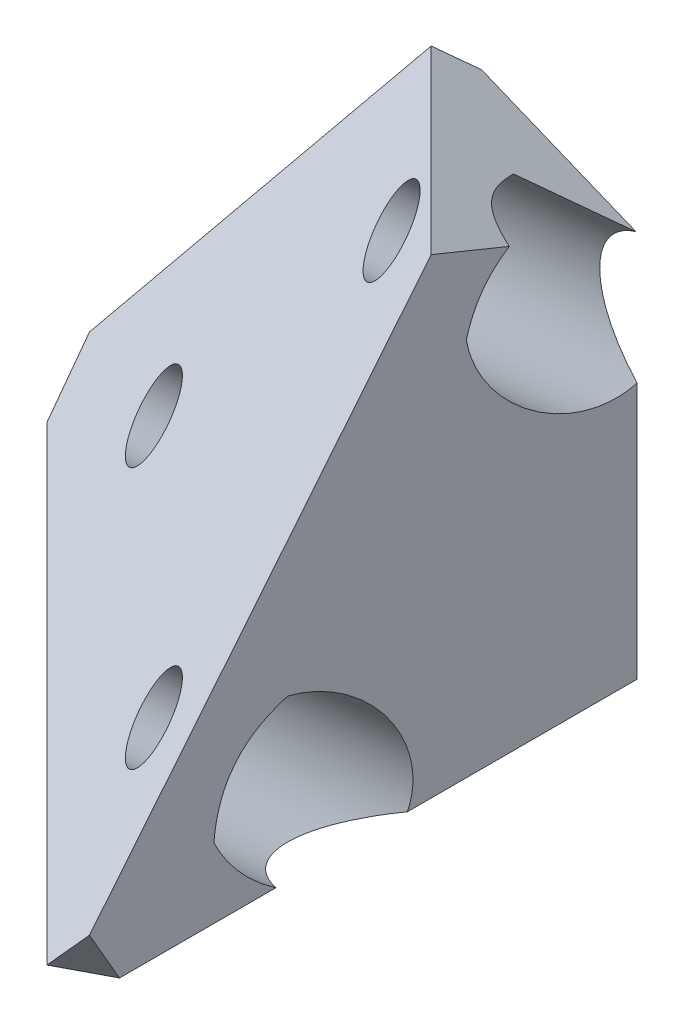
ISO-10303-21;
HEADER;
FILE_DESCRIPTION(('STEP AP214'),'2;1');
FILE_NAME('part.step','',(''),(''),'','','');
FILE_SCHEMA(('AUTOMOTIVE_DESIGN { 1 0 10303 214 1 1 1 1 }'));
ENDSEC;
DATA;
#1=APPLICATION_CONTEXT('core data for automotive mechanical design processes');
#2=APPLICATION_PROTOCOL_DEFINITION('international standard','automotive_design',2000,#1);
#3=PRODUCT_CONTEXT('',#1,'mechanical');
#4=PRODUCT('Part','Part','',(#3));
#5=PRODUCT_RELATED_PRODUCT_CATEGORY('part','',(#4));
#6=PRODUCT_DEFINITION_FORMATION('','',#4);
#7=PRODUCT_DEFINITION_CONTEXT('part definition',#1,'design');
#8=PRODUCT_DEFINITION('design','',#6,#7);
#9=PRODUCT_DEFINITION_SHAPE('','',#8);
#10=(LENGTH_UNIT() NAMED_UNIT(*) SI_UNIT(.MILLI.,.METRE.));
#11=(NAMED_UNIT(*) PLANE_ANGLE_UNIT() SI_UNIT($,.RADIAN.));
#12=(NAMED_UNIT(*) SI_UNIT($,.STERADIAN.) SOLID_ANGLE_UNIT());
#13=UNCERTAINTY_MEASURE_WITH_UNIT(LENGTH_MEASURE(1.E-05),#10,'distance_accuracy_value','');
#14=(GEOMETRIC_REPRESENTATION_CONTEXT(3) GLOBAL_UNCERTAINTY_ASSIGNED_CONTEXT((#13)) GLOBAL_UNIT_ASSIGNED_CONTEXT((#10,
#11,#12)) REPRESENTATION_CONTEXT('',''));
#15=CARTESIAN_POINT('',(0.,0.,0.));
#16=DIRECTION('',(0.,0.,1.));
#17=DIRECTION('',(1.,0.,0.));
#18=AXIS2_PLACEMENT_3D('',#15,#16,#17);
#19=CARTESIAN_POINT('',(7.77817459305202,0.,7.77817459305202));
#20=DIRECTION('',(0.612372435695797,-0.499999999999995,-0.612372435695797));
#21=DIRECTION('',(-0.707106781186548,0.,-0.707106781186548));
#22=AXIS2_PLACEMENT_3D('',#19,#20,#21);
#23=PLANE('',#22);
#24=CARTESIAN_POINT('',(5.48007755419573,3.89711431702999,2.2980970388563));
#25=DIRECTION('',(0.612372435695797,-0.499999999999995,-0.612372435695797));
#26=DIRECTION('',(-0.707106781186548,0.,-0.707106781186548));
#27=AXIS2_PLACEMENT_3D('',#24,#25,#26);
#28=CIRCLE('',#27,1.2);
#29=CARTESIAN_POINT('',(4.63154941677188,3.89711431702999,1.44956890143245));
#30=VERTEX_POINT('',#29);
#31=EDGE_CURVE('E205',#30,#30,#28,.T.);
#32=ORIENTED_EDGE('',*,*,#31,.T.);
#33=EDGE_LOOP('',(#32));
#34=FACE_BOUND('',#33,.T.);
#35=CARTESIAN_POINT('',(5.12652416360242,12.5573683548744,-5.12652416360242));
#36=DIRECTION('',(0.612372435695797,-0.499999999999995,-0.612372435695797));
#37=DIRECTION('',(-0.707106781186548,0.,-0.707106781186548));
#38=AXIS2_PLACEMENT_3D('',#35,#36,#37);
#39=CIRCLE('',#38,1.2);
#40=CARTESIAN_POINT('',(4.27799602617856,12.5573683548744,-5.97505230102627));
#41=VERTEX_POINT('',#40);
#42=EDGE_CURVE('E274',#41,#41,#39,.T.);
#43=ORIENTED_EDGE('',*,*,#42,.T.);
#44=EDGE_LOOP('',(#43));
#45=FACE_BOUND('',#44,.T.);
#46=CARTESIAN_POINT('',(-2.29809703885629,3.89711431702998,-5.48007755419572));
#47=DIRECTION('',(0.612372435695797,-0.499999999999995,-0.612372435695797));
#48=DIRECTION('',(-0.707106781186548,0.,-0.707106781186548));
#49=AXIS2_PLACEMENT_3D('',#46,#47,#48);
#50=CIRCLE('',#49,1.2);
#51=CARTESIAN_POINT('',(-3.14662517628014,3.89711431702998,-6.32860569161957));
#52=VERTEX_POINT('',#51);
#53=EDGE_CURVE('E172',#52,#52,#50,.T.);
#54=ORIENTED_EDGE('',*,*,#53,.T.);
#55=EDGE_LOOP('',(#54));
#56=FACE_BOUND('',#55,.T.);
#57=DIRECTION('',(-0.707106781186548,0.,-0.707106781186548));
#58=VECTOR('',#57,1.);
#59=CARTESIAN_POINT('',(13.493650659546,14.,2.06269852655802));
#60=LINE('',#59,#58);
#61=CARTESIAN_POINT('',(7.77817459305201,14.,-3.652777539936));
#62=VERTEX_POINT('',#61);
#63=CARTESIAN_POINT('',(2.40277753993601,14.,-9.02817459305201));
#64=VERTEX_POINT('',#63);
#65=EDGE_CURVE('E151',#62,#64,#60,.T.);
#66=ORIENTED_EDGE('',*,*,#65,.T.);
#67=DIRECTION('',(-0.632455532033671,-0.774596669241488,0.));
#68=VECTOR('',#67,1.);
#69=CARTESIAN_POINT('',(2.902777539936,14.6123724356958,-9.02817459305201));
#70=LINE('',#69,#68);
#71=CARTESIAN_POINT('',(-7.76326352898467,1.54919333848297,-9.02817459305202));
#72=VERTEX_POINT('',#71);
#73=EDGE_CURVE('E145',#64,#72,#70,.T.);
#74=ORIENTED_EDGE('',*,*,#73,.T.);
#75=DIRECTION('',(-0.070997556956417,0.736685209782636,-0.672498511963955));
#76=VECTOR('',#75,1.);
#77=CARTESIAN_POINT('',(-6.80146553352508,-8.43061988929634,0.0821067811865705));
#78=LINE('',#77,#76);
#79=CARTESIAN_POINT('',(-7.61396103067891,0.,-7.61396103067891));
#80=VERTEX_POINT('',#79);
#81=EDGE_CURVE('E341',#80,#72,#78,.T.);
#82=ORIENTED_EDGE('',*,*,#81,.F.);
#83=DIRECTION('',(0.707106781186548,0.,0.707106781186548));
#84=VECTOR('',#83,1.);
#85=CARTESIAN_POINT('',(-7.77817459305204,0.,-7.77817459305201));
#86=LINE('',#85,#84);
#87=CARTESIAN_POINT('',(6.36396103067893,0.,6.36396103067893));
#88=VERTEX_POINT('',#87);
#89=EDGE_CURVE('E163',#80,#88,#86,.T.);
#90=ORIENTED_EDGE('',*,*,#89,.T.);
#91=DIRECTION('',(0.672498511963954,0.736685209782637,0.070997556956415));
#92=VECTOR('',#91,1.);
#93=CARTESIAN_POINT('',(7.07106781186547,0.774596669241485,6.4386122798318));
#94=LINE('',#93,#92);
#95=CARTESIAN_POINT('',(7.77817459305201,1.54919333848299,6.5132635289847));
#96=VERTEX_POINT('',#95);
#97=EDGE_CURVE('E138',#88,#96,#94,.T.);
#98=ORIENTED_EDGE('',*,*,#97,.T.);
#99=DIRECTION('',(0.,-0.774596669241488,0.632455532033671));
#100=VECTOR('',#99,1.);
#101=CARTESIAN_POINT('',(7.77817459305201,16.0210235533031,-5.30293636118238));
#102=LINE('',#101,#100);
#103=EDGE_CURVE('E154',#62,#96,#102,.T.);
#104=ORIENTED_EDGE('',*,*,#103,.F.);
#105=EDGE_LOOP('',(#66,#74,#82,#90,#98,#104));
#106=FACE_BOUND('',#105,.T.);
#107=ADVANCED_FACE('F36',(#34,#45,#56,#106),#23,.F.);
#108=CARTESIAN_POINT('',(0.,0.,-9.77817459305201));
#109=DIRECTION('',(0.,0.,-1.));
#110=DIRECTION('',(-1.,0.,0.));
#111=AXIS2_PLACEMENT_3D('',#108,#109,#110);
#112=PLANE('',#111);
#113=CARTESIAN_POINT('',(2.77817459305201,9.5,-9.77817459305201));
#114=DIRECTION('',(0.,0.,-1.));
#115=DIRECTION('',(-1.,0.,0.));
#116=AXIS2_PLACEMENT_3D('',#113,#114,#115);
#117=CIRCLE('',#116,1.025);
#118=CARTESIAN_POINT('',(1.75317459305201,9.5,-9.77817459305201));
#119=VERTEX_POINT('',#118);
#120=EDGE_CURVE('E337',#119,#119,#117,.T.);
#121=ORIENTED_EDGE('',*,*,#120,.F.);
#122=EDGE_LOOP('',(#121));
#123=FACE_BOUND('',#122,.T.);
#124=CARTESIAN_POINT('',(5.77817459305201,1.5,-9.77817459305201));
#125=DIRECTION('',(0.,0.,-1.));
#126=DIRECTION('',(-1.,0.,0.));
#127=AXIS2_PLACEMENT_3D('',#124,#125,#126);
#128=CIRCLE('',#127,1.025);
#129=CARTESIAN_POINT('',(4.75317459305201,1.5,-9.77817459305201));
#130=VERTEX_POINT('',#129);
#131=EDGE_CURVE('E328',#130,#130,#128,.T.);
#132=ORIENTED_EDGE('',*,*,#131,.F.);
#133=EDGE_LOOP('',(#132));
#134=FACE_BOUND('',#133,.T.);
#135=CARTESIAN_POINT('',(-3.72182540694799,1.5,-9.77817459305201));
#136=DIRECTION('',(0.,0.,-1.));
#137=DIRECTION('',(-1.,0.,0.));
#138=AXIS2_PLACEMENT_3D('',#135,#136,#137);
#139=CIRCLE('',#138,1.025);
#140=CARTESIAN_POINT('',(-4.74682540694799,1.5,-9.77817459305201));
#141=VERTEX_POINT('',#140);
#142=EDGE_CURVE('E319',#141,#141,#139,.T.);
#143=ORIENTED_EDGE('',*,*,#142,.F.);
#144=EDGE_LOOP('',(#143));
#145=FACE_BOUND('',#144,.T.);
#146=DIRECTION('',(0.632455532033672,0.774596669241487,0.));
#147=VECTOR('',#146,1.);
#148=CARTESIAN_POINT('',(-7.77817459305204,0.,-9.77817459305201));
#149=LINE('',#148,#147);
#150=CARTESIAN_POINT('',(-7.01326352898467,0.936820902787187,-9.778174593052));
#151=VERTEX_POINT('',#150);
#152=CARTESIAN_POINT('',(3.15277753993601,13.3876275643042,-9.77817459305201));
#153=VERTEX_POINT('',#152);
#154=EDGE_CURVE('E144',#151,#153,#149,.T.);
#155=ORIENTED_EDGE('',*,*,#154,.T.);
#156=DIRECTION('',(0.925820099772553,-0.377964473009223,0.));
#157=VECTOR('',#156,1.);
#158=CARTESIAN_POINT('',(5.13509056270002,12.5783516615966,-9.77817459305201));
#159=LINE('',#158,#157);
#160=CARTESIAN_POINT('',(7.74589250207991,11.512496233105,-9.77817459305201));
#161=VERTEX_POINT('',#160);
#162=EDGE_CURVE('E127',#153,#161,#159,.T.);
#163=ORIENTED_EDGE('',*,*,#162,.T.);
#164=CARTESIAN_POINT('',(9.77817459305201,8.75931168355787,-9.77817459305201));
#165=DIRECTION('',(0.,0.,-1.));
#166=DIRECTION('',(0.774596669241488,-0.632455532033671,0.));
#167=AXIS2_PLACEMENT_3D('',#164,#165,#166);
#168=ELLIPSE('',#167,3.59258495608198,2.2);
#169=CARTESIAN_POINT('',(7.77817459305201,7.62987232857541,-9.77817459305201));
#170=VERTEX_POINT('',#169);
#171=EDGE_CURVE('E273',#170,#161,#168,.T.);
#172=ORIENTED_EDGE('',*,*,#171,.F.);
#173=DIRECTION('',(0.,-1.,0.));
#174=VECTOR('',#173,1.);
#175=CARTESIAN_POINT('',(7.77817459305201,14.,-9.77817459305201));
#176=LINE('',#175,#174);
#177=CARTESIAN_POINT('',(7.77817459305201,0.,-9.77817459305201));
#178=VERTEX_POINT('',#177);
#179=EDGE_CURVE('E175',#170,#178,#176,.T.);
#180=ORIENTED_EDGE('',*,*,#179,.T.);
#181=DIRECTION('',(-1.,0.,0.));
#182=VECTOR('',#181,1.);
#183=CARTESIAN_POINT('',(7.77817459305201,0.,-9.77817459305201));
#184=LINE('',#183,#182);
#185=CARTESIAN_POINT('',(4.94670061761697,0.,-9.77817459305201));
#186=VERTEX_POINT('',#185);
#187=EDGE_CURVE('E152',#178,#186,#184,.T.);
#188=ORIENTED_EDGE('',*,*,#187,.T.);
#189=CARTESIAN_POINT('',(2.,0.387732780308283,-9.77817459305201));
#190=DIRECTION('',(0.,0.,-1.));
#191=DIRECTION('',(0.774596669241488,-0.632455532033671,0.));
#192=AXIS2_PLACEMENT_3D('',#189,#190,#191);
#193=ELLIPSE('',#192,3.59258495608198,2.2);
#194=CARTESIAN_POINT('',(-0.566801630294588,0.,-9.77817459305201));
#195=VERTEX_POINT('',#194);
#196=EDGE_CURVE('E169',#195,#186,#193,.T.);
#197=ORIENTED_EDGE('',*,*,#196,.F.);
#198=CARTESIAN_POINT('',(-6.47155050539988,0.,-9.77817459305201));
#199=VERTEX_POINT('',#198);
#200=EDGE_CURVE('E157',#195,#199,#184,.T.);
#201=ORIENTED_EDGE('',*,*,#200,.T.);
#202=DIRECTION('',(-0.500581513841691,0.865689406195987,0.));
#203=VECTOR('',#202,1.);
#204=CARTESIAN_POINT('',(-4.84989739444499,-2.80443420274282,-9.77817459305201));
#205=LINE('',#204,#203);
#206=EDGE_CURVE('E150',#199,#151,#205,.T.);
#207=ORIENTED_EDGE('',*,*,#206,.T.);
#208=EDGE_LOOP('',(#155,#163,#172,#180,#188,#197,#201,#207));
#209=FACE_BOUND('',#208,.T.);
#210=ADVANCED_FACE('F148',(#123,#134,#145,#209),#112,.T.);
#211=CARTESIAN_POINT('',(16.4987931404748,3.511272183616,-22.6241901935908));
#212=DIRECTION('',(-0.47434164902526,0.38729833462074,-0.790569415042093));
#213=DIRECTION('',(-0.857492925712542,0.,0.51449575542753));
#214=AXIS2_PLACEMENT_3D('',#211,#212,#213);
#215=PLANE('',#214);
#216=ORIENTED_EDGE('',*,*,#73,.F.);
#217=DIRECTION('',(-0.612372435695797,0.499999999999995,0.612372435695796));
#218=VECTOR('',#217,1.);
#219=CARTESIAN_POINT('',(8.98640848472507,8.62448784348983,-15.6118055378411));
#220=LINE('',#219,#218);
#221=EDGE_CURVE('E130',#153,#64,#220,.T.);
#222=ORIENTED_EDGE('',*,*,#221,.F.);
#223=ORIENTED_EDGE('',*,*,#154,.F.);
#224=DIRECTION('',(-0.612372435695797,0.499999999999995,0.612372435695796));
#225=VECTOR('',#224,1.);
#226=CARTESIAN_POINT('',(-1.1796325841956,-3.8263188180272,-15.6118055378411));
#227=LINE('',#226,#225);
#228=EDGE_CURVE('E348',#151,#72,#227,.T.);
#229=ORIENTED_EDGE('',*,*,#228,.T.);
#230=EDGE_LOOP('',(#216,#222,#223,#229));
#231=FACE_BOUND('',#230,.T.);
#232=ADVANCED_FACE('F142',(#231),#215,.T.);
#233=CARTESIAN_POINT('',(7.77817459305201,14.,-7.77817459305201));
#234=DIRECTION('',(-1.,0.,0.));
#235=DIRECTION('',(0.,0.,1.));
#236=AXIS2_PLACEMENT_3D('',#233,#234,#235);
#237=PLANE('',#236);
#238=DIRECTION('',(0.,-0.377964473009223,-0.925820099772553));
#239=VECTOR('',#238,1.);
#240=CARTESIAN_POINT('',(7.77817459305201,12.5564117476406,-7.18883215689259));
#241=LINE('',#240,#239);
#242=CARTESIAN_POINT('',(7.77817459305201,13.0514055848529,-5.97634982990018));
#243=VERTEX_POINT('',#242);
#244=EDGE_CURVE('E59',#62,#243,#241,.T.);
#245=ORIENTED_EDGE('',*,*,#244,.F.);
#246=ORIENTED_EDGE('',*,*,#103,.T.);
#247=DIRECTION('',(0.,-0.865689406195988,-0.500581513841689));
#248=VECTOR('',#247,1.);
#249=CARTESIAN_POINT('',(7.77817459305201,4.68688605890053,8.32762207457266));
#250=LINE('',#249,#248);
#251=CARTESIAN_POINT('',(7.77817459305201,0.,5.61744853915022));
#252=VERTEX_POINT('',#251);
#253=EDGE_CURVE('E11',#96,#252,#250,.T.);
#254=ORIENTED_EDGE('',*,*,#253,.T.);
#255=DIRECTION('',(0.,0.,-1.));
#256=VECTOR('',#255,1.);
#257=CARTESIAN_POINT('',(7.77817459305201,0.,-7.77817459305201));
#258=LINE('',#257,#256);
#259=CARTESIAN_POINT('',(7.77817459305201,0.,0.965555556191639));
#260=VERTEX_POINT('',#259);
#261=EDGE_CURVE('E167',#252,#260,#258,.T.);
#262=ORIENTED_EDGE('',*,*,#261,.T.);
#263=CARTESIAN_POINT('',(7.77817459305201,2.02072594216373,0.));
#264=DIRECTION('',(-1.,0.,0.));
#265=DIRECTION('',(0.,-0.632455532033671,-0.774596669241488));
#266=AXIS2_PLACEMENT_3D('',#263,#264,#265);
#267=ELLIPSE('',#266,3.59258495608198,2.2);
#268=CARTESIAN_POINT('',(7.77817459305201,2.08205267061465,2.81219938247284));
#269=VERTEX_POINT('',#268);
#270=EDGE_CURVE('E272',#260,#269,#267,.T.);
#271=ORIENTED_EDGE('',*,*,#270,.T.);
#272=CARTESIAN_POINT('',(7.77817459305201,-1.46523937085973,2.40216880114115));
#273=CARTESIAN_POINT('',(7.77817459305201,-1.34837869357034,2.43021220506226));
#274=CARTESIAN_POINT('',(7.77817459305201,-1.23131853807404,2.45744341729871));
#275=CARTESIAN_POINT('',(7.77817459305201,-0.996758198230225,2.51002099243453));
#276=CARTESIAN_POINT('',(7.77817459305201,-0.87925795123037,2.53536707534943));
#277=CARTESIAN_POINT('',(7.77817459305201,-0.643341097655707,2.58400232488337));
#278=CARTESIAN_POINT('',(7.77817459305201,-0.524922705453131,2.60728287760446));
#279=CARTESIAN_POINT('',(7.77817459305201,-0.28762276868389,2.65133264591242));
#280=CARTESIAN_POINT('',(7.77817459305201,-0.168741244465505,2.67210197057691));
#281=CARTESIAN_POINT('',(7.77817459305201,0.075079307116677,2.71162416893788));
#282=CARTESIAN_POINT('',(7.77817459305201,0.200041243821958,2.73023702466399));
#283=CARTESIAN_POINT('',(7.77817459305201,0.450469439276992,2.76367392375601));
#284=CARTESIAN_POINT('',(7.77817459305201,0.575935665668776,2.77849820639632));
#285=CARTESIAN_POINT('',(7.77817459305201,0.827142663671958,2.80360117956389));
#286=CARTESIAN_POINT('',(7.77817459305201,0.952882746567789,2.81388661771524));
#287=CARTESIAN_POINT('',(7.77817459305201,1.20467775112745,2.82900788625435));
#288=CARTESIAN_POINT('',(7.77817459305201,1.33073259721409,2.83384491839403));
#289=CARTESIAN_POINT('',(7.77817459305201,1.58107983627891,2.83686106851646));
#290=CARTESIAN_POINT('',(7.77817459305201,1.70537074218489,2.83513753266637));
#291=CARTESIAN_POINT('',(7.77817459305201,1.95367531390866,2.82380631922013));
#292=CARTESIAN_POINT('',(7.77817459305201,2.07768886205951,2.81419576594866));
#293=CARTESIAN_POINT('',(7.77817459305201,2.32340935798838,2.78545202560531));
#294=CARTESIAN_POINT('',(7.77817459305201,2.44512699019545,2.76641381110682));
#295=CARTESIAN_POINT('',(7.77817459305201,2.68619326027645,2.71684112920488));
#296=CARTESIAN_POINT('',(7.77817459305201,2.80554396207554,2.68631718714397));
#297=CARTESIAN_POINT('',(7.77817459305201,2.99252384775001,2.62682048084125));
#298=CARTESIAN_POINT('',(7.77817459305201,3.06154962734746,2.60221282772116));
#299=CARTESIAN_POINT('',(7.77817459305201,3.19752539554464,2.54783217231711));
#300=CARTESIAN_POINT('',(7.77817459305201,3.26447616075961,2.51806113073656));
#301=CARTESIAN_POINT('',(7.77817459305201,3.39565815760516,2.45311952961341));
#302=CARTESIAN_POINT('',(7.77817459305201,3.45989129772559,2.41795284231668));
#303=CARTESIAN_POINT('',(7.77817459305201,3.58504286186643,2.34213175634248));
#304=CARTESIAN_POINT('',(7.77817459305201,3.64596131254885,2.3014774018147));
#305=CARTESIAN_POINT('',(7.77817459305201,3.7641595535538,2.21462272075713));
#306=CARTESIAN_POINT('',(7.77817459305201,3.82142066089097,2.16839693769356));
#307=CARTESIAN_POINT('',(7.77817459305201,3.93149847759505,2.07093215914904));
#308=CARTESIAN_POINT('',(7.77817459305201,3.9843152499389,2.01969323472737));
#309=CARTESIAN_POINT('',(7.77817459305201,4.08522524265884,1.91273950048749));
#310=CARTESIAN_POINT('',(7.77817459305201,4.13331708310807,1.85702339168333));
#311=CARTESIAN_POINT('',(7.77817459305201,4.22468185310455,1.74177750797472));
#312=CARTESIAN_POINT('',(7.77817459305201,4.26795408130578,1.68224718000856));
#313=CARTESIAN_POINT('',(7.77817459305201,4.36314033058143,1.54008524088639));
#314=CARTESIAN_POINT('',(7.77817459305201,4.4132654241259,1.45625516289575));
#315=CARTESIAN_POINT('',(7.77817459305201,4.50583006920854,1.28446101418824));
#316=CARTESIAN_POINT('',(7.77817459305201,4.54826617069025,1.19649510990935));
#317=CARTESIAN_POINT('',(7.77817459305201,4.62664030921155,1.01674246432798));
#318=CARTESIAN_POINT('',(7.77817459305201,4.66251243988357,0.924927262726007));
#319=CARTESIAN_POINT('',(7.77817459305201,4.72813362656173,0.739192491949394));
#320=CARTESIAN_POINT('',(7.77817459305201,4.75788445306765,0.645273539993979));
#321=CARTESIAN_POINT('',(7.77817459305201,4.82202477676682,0.421369385871752));
#322=CARTESIAN_POINT('',(7.77817459305201,4.85414160860193,0.29073659104298));
#323=CARTESIAN_POINT('',(7.77817459305201,4.9104058333661,0.0277387530766699));
#324=CARTESIAN_POINT('',(7.77817459305201,4.9345488094387,-0.104627208032631));
#325=CARTESIAN_POINT('',(7.77817459305201,4.9763814934383,-0.370815912091538));
#326=CARTESIAN_POINT('',(7.77817459305201,4.99404903194207,-0.504642073668993));
#327=CARTESIAN_POINT('',(7.77817459305201,5.02397878746291,-0.772855349756281));
#328=CARTESIAN_POINT('',(7.77817459305201,5.03624208942657,-0.907242346200019));
#329=CARTESIAN_POINT('',(7.77817459305201,5.05574179538574,-1.16908172451194));
#330=CARTESIAN_POINT('',(7.77817459305201,5.06321370922737,-1.29651707701414));
#331=CARTESIAN_POINT('',(7.77817459305201,5.0747553422517,-1.55154833281685));
#332=CARTESIAN_POINT('',(7.77817459305201,5.07882477094299,-1.67914424889449));
#333=CARTESIAN_POINT('',(7.77817459305201,5.08403797506982,-1.93334232046244));
#334=CARTESIAN_POINT('',(7.77817459305201,5.08520552096815,-2.05994402454192));
#335=CARTESIAN_POINT('',(7.77817459305201,5.08506159046554,-2.31311334794636));
#336=CARTESIAN_POINT('',(7.77817459305201,5.0837507778965,-2.43968096731928));
#337=CARTESIAN_POINT('',(7.77817459305201,5.08138973635184,-2.56622130545494));
#338=B_SPLINE_CURVE_WITH_KNOTS('',3,(#272,#273,#274,#275,#276,#277,#278,#279,#280,#281,#282,
#283,#284,#285,#286,#287,#288,#289,#290,#291,#292,#293,#294,#295,#296,#297,#298,#299,#300,#301,
#302,#303,#304,#305,#306,#307,#308,#309,#310,#311,#312,#313,#314,#315,#316,#317,#318,#319,#320,
#321,#322,#323,#324,#325,#326,#327,#328,#329,#330,#331,#332,#333,#334,#335,#336,#337),
.UNSPECIFIED.,.F.,.F.,(4,2,2,2,2,2,2,2,2,2,2,2,2,2,2,2,2,2,2,2,2,2,2,2,2,2,2,2,2,2,2,2,4),(0.,
0.360538916809042,0.721131275334835,1.08316292244804,1.44517883871459,1.82415156293787,
2.20310034651284,2.58148385632234,2.95978388993559,3.33249271653441,3.70533749642828,
4.07450045770999,4.44332594440326,4.66298977265172,4.88257036943632,5.10199411252672,
5.32141609040214,5.54188161681566,5.7623440186712,5.98287061685024,6.20342926406613,
6.49597282088031,6.78864731888483,7.08411604035172,7.37949918120376,7.78273566281232,
8.18619513092748,8.59102326505938,8.99577008942413,9.37868057147329,9.76162374164488,
10.1414195800544,10.5211137040117),.UNSPECIFIED.);
#339=CARTESIAN_POINT('',(7.77817459305201,4.76384201328488,0.622527553414212));
#340=VERTEX_POINT('',#339);
#341=EDGE_CURVE('E265',#269,#340,#338,.T.);
#342=ORIENTED_EDGE('',*,*,#341,.T.);
#343=CARTESIAN_POINT('',(7.77817459305201,0.,-2.94545454351396));
#344=VERTEX_POINT('',#343);
#345=EDGE_CURVE('E204',#340,#344,#267,.T.);
#346=ORIENTED_EDGE('',*,*,#345,.T.);
#347=EDGE_CURVE('E166',#344,#178,#258,.T.);
#348=ORIENTED_EDGE('',*,*,#347,.T.);
#349=ORIENTED_EDGE('',*,*,#179,.F.);
#350=CARTESIAN_POINT('',(7.77817459305201,10.3923048454133,-7.77817459305201));
#351=DIRECTION('',(-1.,0.,0.));
#352=DIRECTION('',(0.,-0.632455532033671,-0.774596669241488));
#353=AXIS2_PLACEMENT_3D('',#350,#351,#352);
#354=ELLIPSE('',#353,3.59258495608198,2.2);
#355=CARTESIAN_POINT('',(7.77817459305201,11.2820436393967,-4.69956178810359));
#356=VERTEX_POINT('',#355);
#357=EDGE_CURVE('E184',#170,#356,#354,.T.);
#358=ORIENTED_EDGE('',*,*,#357,.T.);
#359=CARTESIAN_POINT('',(7.77817459305201,7.00249953389614,-4.88708142728171));
#360=CARTESIAN_POINT('',(7.77817459305201,7.12777052495781,-4.86010995895349));
#361=CARTESIAN_POINT('',(7.77817459305201,7.2532589601214,-4.83411975783075));
#362=CARTESIAN_POINT('',(7.77817459305201,7.50470908989263,-4.78441760731941));
#363=CARTESIAN_POINT('',(7.77817459305201,7.63067086693296,-4.76070607587488));
#364=CARTESIAN_POINT('',(7.77817459305201,7.88369905860409,-4.71577364359335));
#365=CARTESIAN_POINT('',(7.77817459305201,8.01076783719855,-4.69456595929945));
#366=CARTESIAN_POINT('',(7.77817459305201,8.26537264781197,-4.65519382271879));
#367=CARTESIAN_POINT('',(7.77817459305201,8.39290865642879,-4.63702922008641));
#368=CARTESIAN_POINT('',(7.77817459305201,8.65540398412109,-4.60334525661565));
#369=CARTESIAN_POINT('',(7.77817459305201,8.79038907104462,-4.58802400682817));
#370=CARTESIAN_POINT('',(7.77817459305201,9.06080526808491,-4.56204013315484));
#371=CARTESIAN_POINT('',(7.77817459305201,9.19623634258187,-4.55137714590211));
#372=CARTESIAN_POINT('',(7.77817459305201,9.46717694155111,-4.53562796844191));
#373=CARTESIAN_POINT('',(7.77817459305201,9.60268582535412,-4.53053119556042));
#374=CARTESIAN_POINT('',(7.77817459305201,9.8737796268596,-4.52700778879887));
#375=CARTESIAN_POINT('',(7.77817459305201,10.0093645192152,-4.52857958793403));
#376=CARTESIAN_POINT('',(7.77817459305201,10.2778968095452,-4.53970249982042));
#377=CARTESIAN_POINT('',(7.77817459305201,10.4108494260686,-4.54911576511537));
#378=CARTESIAN_POINT('',(7.77817459305201,10.6758395066159,-4.577387501796));
#379=CARTESIAN_POINT('',(7.77817459305201,10.807876648335,-4.59624914386569));
#380=CARTESIAN_POINT('',(7.77817459305201,11.0682870450279,-4.64503280395969));
#381=CARTESIAN_POINT('',(7.77817459305201,11.1966853193418,-4.67481778588721));
#382=CARTESIAN_POINT('',(7.77817459305201,11.4497188754518,-4.7474300526326));
#383=CARTESIAN_POINT('',(7.77817459305201,11.5743578676512,-4.79024398184206));
#384=CARTESIAN_POINT('',(7.77817459305201,11.7716419616484,-4.87161137962604));
#385=CARTESIAN_POINT('',(7.77817459305201,11.8461517902947,-4.90567116557925));
#386=CARTESIAN_POINT('',(7.77817459305201,11.9921370831937,-4.97970542093812));
#387=CARTESIAN_POINT('',(7.77817459305201,12.0636143836637,-5.01967624344373));
#388=CARTESIAN_POINT('',(7.77817459305201,12.2029000479998,-5.1056098744135));
#389=CARTESIAN_POINT('',(7.77817459305201,12.2707076559282,-5.1515739108505));
#390=CARTESIAN_POINT('',(7.77817459305201,12.4020054267917,-5.24931118332886));
#391=CARTESIAN_POINT('',(7.77817459305201,12.4654954912856,-5.30108455175349));
#392=CARTESIAN_POINT('',(7.77817459305201,12.5876443909077,-5.41002376119841));
#393=CARTESIAN_POINT('',(7.77817459305201,12.646304003169,-5.46718873161943));
#394=CARTESIAN_POINT('',(7.77817459305201,12.7584989786755,-5.58633187437504));
#395=CARTESIAN_POINT('',(7.77817459305201,12.8120343358337,-5.64831005242697));
#396=CARTESIAN_POINT('',(7.77817459305201,12.9139204491413,-5.77643004160631));
#397=CARTESIAN_POINT('',(7.77817459305201,12.9622684884449,-5.84257400605255));
#398=CARTESIAN_POINT('',(7.77817459305201,13.0538586322624,-5.978298514847));
#399=CARTESIAN_POINT('',(7.77817459305201,13.0971000434112,-6.04787952405354));
#400=CARTESIAN_POINT('',(7.77817459305201,13.2004806651461,-6.22765997323781));
#401=CARTESIAN_POINT('',(7.77817459305201,13.2573461680321,-6.33974663452367));
#402=CARTESIAN_POINT('',(7.77817459305201,13.3609444488657,-6.56850750007883));
#403=CARTESIAN_POINT('',(7.77817459305201,13.4076707106562,-6.68518459791407));
#404=CARTESIAN_POINT('',(7.77817459305201,13.4928003920209,-6.92280455166958));
#405=CARTESIAN_POINT('',(7.77817459305201,13.5311168327734,-7.04377820371592));
#406=CARTESIAN_POINT('',(7.77817459305201,13.6001703114139,-7.28778266668618));
#407=CARTESIAN_POINT('',(7.77817459305201,13.6309102666616,-7.41081266625733));
#408=CARTESIAN_POINT('',(7.77817459305201,13.7017251539112,-7.72873523985163));
#409=CARTESIAN_POINT('',(7.77817459305201,13.7371491900734,-7.92465846321014));
#410=CARTESIAN_POINT('',(7.77817459305201,13.7959729105963,-8.31834382475827));
#411=CARTESIAN_POINT('',(7.77817459305201,13.8193644189702,-8.51610712060663));
#412=CARTESIAN_POINT('',(7.77817459305201,13.8568020584816,-8.91323316815717));
#413=CARTESIAN_POINT('',(7.77817459305201,13.8708129455352,-9.11259913514817));
#414=CARTESIAN_POINT('',(7.77817459305201,13.8913092203432,-9.51164298320562));
#415=CARTESIAN_POINT('',(7.77817459305201,13.8977965470702,-9.71132077061996));
#416=CARTESIAN_POINT('',(7.77817459305201,13.904478116677,-10.0976817575583));
#417=CARTESIAN_POINT('',(7.77817459305201,13.9050568433797,-10.284359146881));
#418=CARTESIAN_POINT('',(7.77817459305201,13.9018157158536,-10.6576874298604));
#419=CARTESIAN_POINT('',(7.77817459305201,13.8979954580925,-10.8443383195153));
#420=CARTESIAN_POINT('',(7.77817459305201,13.8867167702193,-11.2158833493006));
#421=CARTESIAN_POINT('',(7.77817459305201,13.8792906017118,-11.4007785152338));
#422=CARTESIAN_POINT('',(7.77817459305201,13.8613378856527,-11.7703741346346));
#423=CARTESIAN_POINT('',(7.77817459305201,13.8508121011155,-11.9550746248081));
#424=CARTESIAN_POINT('',(7.77817459305201,13.8389960091991,-12.1396835157929));
#425=B_SPLINE_CURVE_WITH_KNOTS('',3,(#359,#360,#361,#362,#363,#364,#365,#366,#367,#368,#369,
#370,#371,#372,#373,#374,#375,#376,#377,#378,#379,#380,#381,#382,#383,#384,#385,#386,#387,#388,
#389,#390,#391,#392,#393,#394,#395,#396,#397,#398,#399,#400,#401,#402,#403,#404,#405,#406,#407,
#408,#409,#410,#411,#412,#413,#414,#415,#416,#417,#418,#419,#420,#421,#422,#423,#424),
.UNSPECIFIED.,.F.,.F.,(4,2,2,2,2,2,2,2,2,2,2,2,2,2,2,2,2,2,2,2,2,2,2,2,2,2,2,2,2,2,2,2,4),(0.,
0.384429937740246,0.768930251970854,1.15537710256807,1.54180485485023,1.94929224807678,
2.35674784964979,2.7634274270078,3.17001144786485,3.56959522594732,3.96931318617876,
4.36417914951348,4.75864170252556,5.00418404397905,5.24957552168661,5.49501735784732,
5.74046478828206,5.98587265316597,6.23128080956009,6.47681687685258,6.72238624417204,
7.09880896711997,7.47547289276548,7.85586591520164,8.23611223596844,8.83286837086136,
9.43002946195061,10.029421751549,10.6286595313628,11.1886341264531,11.7486600938012,
12.3037654127251,12.8587341987113),.UNSPECIFIED.);
#426=EDGE_CURVE('E171',#356,#243,#425,.T.);
#427=ORIENTED_EDGE('',*,*,#426,.T.);
#428=EDGE_LOOP('',(#245,#246,#254,#262,#271,#342,#346,#348,#349,#358,#427));
#429=FACE_BOUND('',#428,.T.);
#430=ADVANCED_FACE('F38',(#429),#237,.F.);
#431=CARTESIAN_POINT('',(12.474993391952,6.55736835487446,-12.474993391952));
#432=DIRECTION('',(0.612372435695797,-0.499999999999995,-0.612372435695797));
#433=DIRECTION('',(-0.707106781186547,0.,-0.707106781186548));
#434=AXIS2_PLACEMENT_3D('',#431,#432,#433);
#435=CYLINDRICAL_SURFACE('',#434,2.2);
#436=DIRECTION('',(0.612372435695797,-0.499999999999995,-0.612372435695797));
#437=VECTOR('',#436,1.);
#438=CARTESIAN_POINT('',(12.0478042493575,8.00000000000006,-14.0800863403296));
#439=LINE('',#438,#437);
#440=CARTESIAN_POINT('',(5.92407989239955,13.,-7.95636198337165));
#441=VERTEX_POINT('',#440);
#442=EDGE_CURVE('E133',#441,#161,#439,.T.);
#443=ORIENTED_EDGE('',*,*,#442,.F.);
#444=CARTESIAN_POINT('',(6.35126903499401,11.5573683548744,-6.35126903499401));
#445=DIRECTION('',(0.612372435695797,-0.499999999999995,-0.612372435695797));
#446=DIRECTION('',(-0.707106781186547,0.,-0.707106781186548));
#447=AXIS2_PLACEMENT_3D('',#444,#445,#446);
#448=CIRCLE('',#447,2.2);
#449=EDGE_CURVE('E304',#356,#441,#448,.T.);
#450=ORIENTED_EDGE('',*,*,#449,.F.);
#451=ORIENTED_EDGE('',*,*,#357,.F.);
#452=ORIENTED_EDGE('',*,*,#171,.T.);
#453=EDGE_LOOP('',(#443,#450,#451,#452));
#454=FACE_BOUND('',#453,.T.);
#455=ADVANCED_FACE('F192',(#454),#435,.F.);
#456=CARTESIAN_POINT('',(6.35126903499401,11.5573683548744,-6.35126903499401));
#457=DIRECTION('',(0.612372435695797,-0.499999999999995,-0.612372435695797));
#458=DIRECTION('',(-0.707106781186547,0.,-0.707106781186548));
#459=AXIS2_PLACEMENT_3D('',#456,#457,#458);
#460=CONICAL_SURFACE('',#459,2.2,0.785398163397447);
#461=CARTESIAN_POINT('',(5.73889659929821,12.0573683548744,-5.73889659929821));
#462=DIRECTION('',(0.612372435695797,-0.499999999999995,-0.612372435695797));
#463=DIRECTION('',(-0.707106781186547,0.,-0.707106781186548));
#464=AXIS2_PLACEMENT_3D('',#461,#462,#463);
#465=CIRCLE('',#464,1.2);
#466=CARTESIAN_POINT('',(4.89036846187436,12.0573683548744,-6.58742473672207));
#467=VERTEX_POINT('',#466);
#468=EDGE_CURVE('E301',#467,#467,#465,.T.);
#469=ORIENTED_EDGE('',*,*,#468,.F.);
#470=EDGE_LOOP('',(#469));
#471=FACE_BOUND('',#470,.T.);
#472=CARTESIAN_POINT('',(7.77837459305201,13.0513492862813,-5.97628773267386));
#473=CARTESIAN_POINT('',(7.71190202564667,13.0700469878633,-5.99696047184061));
#474=CARTESIAN_POINT('',(7.64559925549541,13.0881636029648,-6.01888677912676));
#475=CARTESIAN_POINT('',(7.51348346887444,13.1228238608447,-6.06610261958855));
#476=CARTESIAN_POINT('',(7.44767338185295,13.1393610748568,-6.09140497051324));
#477=CARTESIAN_POINT('',(7.31591071581519,13.1706083181567,-6.14662783459763));
#478=CARTESIAN_POINT('',(7.24998177190962,13.1852750282337,-6.17663082260939));
#479=CARTESIAN_POINT('',(7.12018938972561,13.2116525182471,-6.2418118135652));
#480=CARTESIAN_POINT('',(7.05632296266299,13.223367759712,-6.27698187682524));
#481=CARTESIAN_POINT('',(6.95144382506492,13.2399301528335,-6.34129160235618));
#482=CARTESIAN_POINT('',(6.90959861521068,13.2457774172174,-6.36881399807867));
#483=CARTESIAN_POINT('',(6.82779649158766,13.2554685173721,-6.42687787127668));
#484=CARTESIAN_POINT('',(6.7878395875188,13.2593123428524,-6.45741936425832));
#485=CARTESIAN_POINT('',(6.71066247840321,13.2647711431558,-6.52122519802277));
#486=CARTESIAN_POINT('',(6.67341899468058,13.2664079193216,-6.55445941531622));
#487=CARTESIAN_POINT('',(6.6016211380062,13.2674327696895,-6.62374691152637));
#488=CARTESIAN_POINT('',(6.56706665665657,13.2668209345848,-6.65980007668932));
#489=CARTESIAN_POINT('',(6.50095948922109,13.2633866012164,-6.73431960848403));
#490=CARTESIAN_POINT('',(6.46940053845744,13.2605688358616,-6.77278064658178));
#491=CARTESIAN_POINT('',(6.40924781784972,13.2528780602444,-6.85177184317792));
#492=CARTESIAN_POINT('',(6.38065545828763,13.2480040780082,-6.89230297223422));
#493=CARTESIAN_POINT('',(6.29862040694568,13.2305074007273,-7.01719595510845));
#494=CARTESIAN_POINT('',(6.24959339215005,13.2150529279138,-7.10407854254092));
#495=CARTESIAN_POINT('',(6.1689017151156,13.1819178698988,-7.26593420430944));
#496=CARTESIAN_POINT('',(6.1357004675142,13.1650896260886,-7.34035606251304));
#497=CARTESIAN_POINT('',(6.07442988258901,13.1287116535029,-7.49073411815016));
#498=CARTESIAN_POINT('',(6.04636730210605,13.1091584002295,-7.56669219196434));
#499=CARTESIAN_POINT('',(5.99501083067041,13.0686732138395,-7.71721671219701));
#500=CARTESIAN_POINT('',(5.97160297813351,13.0477971251751,-7.79176032978672));
#501=CARTESIAN_POINT('',(5.92785101652553,13.0046996313795,-7.94107916038682));
#502=CARTESIAN_POINT('',(5.9074971775934,12.9824828291747,-8.01585282843691));
#503=CARTESIAN_POINT('',(5.88823424420369,12.9597817803445,-8.09072174808661));
#504=B_SPLINE_CURVE_WITH_KNOTS('',3,(#472,#473,#474,#475,#476,#477,#478,#479,#480,#481,#482,
#483,#484,#485,#486,#487,#488,#489,#490,#491,#492,#493,#494,#495,#496,#497,#498,#499,#500,#501,
#502,#503),.UNSPECIFIED.,.F.,.F.,(4,2,2,2,2,2,2,2,2,2,2,2,2,2,2,4),(0.,0.216306788490697,
0.433459522717085,0.654969321691161,0.876142243119182,1.02727546967134,1.17840947248602,
1.32803935303209,1.47766319863668,1.62696689735984,1.77634125116647,2.07814668855809,
2.32755323802493,2.57728541383946,2.81983325844457,3.06159116135826),.UNSPECIFIED.);
#505=EDGE_CURVE('E45',#243,#441,#504,.T.);
#506=ORIENTED_EDGE('',*,*,#505,.F.);
#507=ORIENTED_EDGE('',*,*,#426,.F.);
#508=ORIENTED_EDGE('',*,*,#449,.T.);
#509=EDGE_LOOP('',(#506,#507,#508));
#510=FACE_BOUND('',#509,.T.);
#511=ADVANCED_FACE('F186',(#471,#510),#460,.F.);
#512=CARTESIAN_POINT('',(0.,0.,0.));
#513=DIRECTION('',(0.,-1.,0.));
#514=DIRECTION('',(0.,0.,-1.));
#515=AXIS2_PLACEMENT_3D('',#512,#513,#514);
#516=PLANE('',#515);
#517=DIRECTION('',(0.884353258475268,0.,-0.46681828822806));
#518=VECTOR('',#517,1.);
#519=CARTESIAN_POINT('',(4.01407852947244,0.,7.6043795130415));
#520=LINE('',#519,#518);
#521=EDGE_CURVE('E52',#88,#252,#520,.T.);
#522=ORIENTED_EDGE('',*,*,#521,.F.);
#523=ORIENTED_EDGE('',*,*,#89,.F.);
#524=DIRECTION('',(0.466818288228059,0.,-0.884353258475268));
#525=VECTOR('',#524,1.);
#526=CARTESIAN_POINT('',(-9.09802071314918,0.,-4.80251801514055));
#527=LINE('',#526,#525);
#528=EDGE_CURVE('E344',#80,#199,#527,.T.);
#529=ORIENTED_EDGE('',*,*,#528,.T.);
#530=ORIENTED_EDGE('',*,*,#200,.F.);
#531=CARTESIAN_POINT('',(2.47487373415298,0.,-10.253048327205));
#532=DIRECTION('',(0.,-1.,0.));
#533=DIRECTION('',(0.707106781186548,0.,-0.707106781186547));
#534=AXIS2_PLACEMENT_3D('',#531,#532,#533);
#535=ELLIPSE('',#534,4.40000000000004,2.2);
#536=EDGE_CURVE('E176',#186,#195,#535,.T.);
#537=ORIENTED_EDGE('',*,*,#536,.F.);
#538=ORIENTED_EDGE('',*,*,#187,.F.);
#539=ORIENTED_EDGE('',*,*,#347,.F.);
#540=CARTESIAN_POINT('',(10.253048327205,0.,-2.47487373415298));
#541=DIRECTION('',(0.,-1.,0.));
#542=DIRECTION('',(0.707106781186548,0.,-0.707106781186547));
#543=AXIS2_PLACEMENT_3D('',#540,#541,#542);
#544=ELLIPSE('',#543,4.40000000000004,2.2);
#545=EDGE_CURVE('E288',#260,#344,#544,.T.);
#546=ORIENTED_EDGE('',*,*,#545,.F.);
#547=ORIENTED_EDGE('',*,*,#261,.F.);
#548=EDGE_LOOP('',(#522,#523,#529,#530,#537,#538,#539,#546,#547));
#549=FACE_BOUND('',#548,.T.);
#550=ADVANCED_FACE('F191',(#549),#516,.T.);
#551=CARTESIAN_POINT('',(5.05037218949327,-2.10288568296996,-12.8285467825453));
#552=DIRECTION('',(0.612372435695797,-0.499999999999995,-0.612372435695797));
#553=DIRECTION('',(-0.707106781186547,0.,-0.707106781186548));
#554=AXIS2_PLACEMENT_3D('',#551,#552,#553);
#555=CYLINDRICAL_SURFACE('',#554,1.2);
#556=CARTESIAN_POINT('',(-1.6857246031605,3.39711431702999,-6.09244998989151));
#557=DIRECTION('',(0.612372435695797,-0.499999999999995,-0.612372435695797));
#558=DIRECTION('',(-0.707106781186547,0.,-0.707106781186548));
#559=AXIS2_PLACEMENT_3D('',#556,#557,#558);
#560=CIRCLE('',#559,1.2);
#561=CARTESIAN_POINT('',(-2.53425274058435,3.39711431702999,-6.94097812731537));
#562=VERTEX_POINT('',#561);
#563=EDGE_CURVE('E295',#562,#562,#560,.T.);
#564=ORIENTED_EDGE('',*,*,#563,.T.);
#565=EDGE_LOOP('',(#564));
#566=FACE_BOUND('',#565,.T.);
#567=ORIENTED_EDGE('',*,*,#53,.F.);
#568=EDGE_LOOP('',(#567));
#569=FACE_BOUND('',#568,.T.);
#570=ADVANCED_FACE('F377',(#566,#569),#555,.F.);
#571=CARTESIAN_POINT('',(-1.0733521674647,2.89711431702999,-6.70482242558731));
#572=DIRECTION('',(0.612372435695797,-0.499999999999995,-0.612372435695797));
#573=DIRECTION('',(-0.707106781186547,0.,-0.707106781186548));
#574=AXIS2_PLACEMENT_3D('',#571,#572,#573);
#575=CONICAL_SURFACE('',#574,2.2,0.785398163397447);
#576=ORIENTED_EDGE('',*,*,#563,.F.);
#577=EDGE_LOOP('',(#576));
#578=FACE_BOUND('',#577,.T.);
#579=CARTESIAN_POINT('',(-1.0733521674647,2.89711431702999,-6.70482242558731));
#580=DIRECTION('',(0.612372435695797,-0.499999999999995,-0.612372435695797));
#581=DIRECTION('',(-0.707106781186547,0.,-0.707106781186548));
#582=AXIS2_PLACEMENT_3D('',#579,#580,#581);
#583=CIRCLE('',#582,2.2);
#584=CARTESIAN_POINT('',(-2.6289870860751,2.89711431702999,-8.26045734419771));
#585=VERTEX_POINT('',#584);
#586=EDGE_CURVE('E298',#585,#585,#583,.T.);
#587=ORIENTED_EDGE('',*,*,#586,.T.);
#588=EDGE_LOOP('',(#587));
#589=FACE_BOUND('',#588,.T.);
#590=ADVANCED_FACE('F381',(#578,#589),#575,.F.);
#591=CARTESIAN_POINT('',(5.05037218949327,-2.10288568296996,-12.8285467825453));
#592=DIRECTION('',(0.612372435695797,-0.499999999999995,-0.612372435695797));
#593=DIRECTION('',(-0.707106781186547,0.,-0.707106781186548));
#594=AXIS2_PLACEMENT_3D('',#591,#592,#593);
#595=CYLINDRICAL_SURFACE('',#594,2.2);
#596=ORIENTED_EDGE('',*,*,#536,.T.);
#597=ORIENTED_EDGE('',*,*,#196,.T.);
#598=EDGE_LOOP('',(#596,#597));
#599=FACE_BOUND('',#598,.T.);
#600=ORIENTED_EDGE('',*,*,#586,.F.);
#601=EDGE_LOOP('',(#600));
#602=FACE_BOUND('',#601,.T.);
#603=ADVANCED_FACE('F386',(#599,#602),#595,.F.);
#604=CARTESIAN_POINT('',(12.474993391952,6.55736835487446,-12.474993391952));
#605=DIRECTION('',(0.612372435695797,-0.499999999999995,-0.612372435695797));
#606=DIRECTION('',(-0.707106781186547,0.,-0.707106781186548));
#607=AXIS2_PLACEMENT_3D('',#604,#605,#606);
#608=CYLINDRICAL_SURFACE('',#607,1.2);
#609=ORIENTED_EDGE('',*,*,#468,.T.);
#610=EDGE_LOOP('',(#609));
#611=FACE_BOUND('',#610,.T.);
#612=ORIENTED_EDGE('',*,*,#42,.F.);
#613=EDGE_LOOP('',(#612));
#614=FACE_BOUND('',#613,.T.);
#615=ADVANCED_FACE('F195',(#611,#614),#608,.F.);
#616=CARTESIAN_POINT('',(12.8285467825453,-2.10288568296995,-5.05037218949326));
#617=DIRECTION('',(0.612372435695797,-0.499999999999995,-0.612372435695797));
#618=DIRECTION('',(-0.707106781186547,0.,-0.707106781186548));
#619=AXIS2_PLACEMENT_3D('',#616,#617,#618);
#620=CYLINDRICAL_SURFACE('',#619,2.2);
#621=CARTESIAN_POINT('',(6.70482242558732,2.89711431703,1.07335216746471));
#622=DIRECTION('',(0.612372435695797,-0.499999999999995,-0.612372435695797));
#623=DIRECTION('',(-0.707106781186547,0.,-0.707106781186548));
#624=AXIS2_PLACEMENT_3D('',#621,#622,#623);
#625=CIRCLE('',#624,2.2);
#626=EDGE_CURVE('E311',#269,#340,#625,.T.);
#627=ORIENTED_EDGE('',*,*,#626,.F.);
#628=ORIENTED_EDGE('',*,*,#270,.F.);
#629=ORIENTED_EDGE('',*,*,#545,.T.);
#630=ORIENTED_EDGE('',*,*,#345,.F.);
#631=EDGE_LOOP('',(#627,#628,#629,#630));
#632=FACE_BOUND('',#631,.T.);
#633=ADVANCED_FACE('F256',(#632),#620,.F.);
#634=CARTESIAN_POINT('',(12.8285467825453,-2.10288568296995,-5.05037218949326));
#635=DIRECTION('',(0.612372435695797,-0.499999999999995,-0.612372435695797));
#636=DIRECTION('',(-0.707106781186547,0.,-0.707106781186548));
#637=AXIS2_PLACEMENT_3D('',#634,#635,#636);
#638=CYLINDRICAL_SURFACE('',#637,1.2);
#639=CARTESIAN_POINT('',(6.09244998989153,3.39711431702999,1.68572460316051));
#640=DIRECTION('',(0.612372435695797,-0.499999999999995,-0.612372435695797));
#641=DIRECTION('',(-0.707106781186547,0.,-0.707106781186548));
#642=AXIS2_PLACEMENT_3D('',#639,#640,#641);
#643=CIRCLE('',#642,1.2);
#644=CARTESIAN_POINT('',(5.24392185246767,3.39711431702999,0.837196465736651));
#645=VERTEX_POINT('',#644);
#646=EDGE_CURVE('E308',#645,#645,#643,.T.);
#647=ORIENTED_EDGE('',*,*,#646,.T.);
#648=EDGE_LOOP('',(#647));
#649=FACE_BOUND('',#648,.T.);
#650=ORIENTED_EDGE('',*,*,#31,.F.);
#651=EDGE_LOOP('',(#650));
#652=FACE_BOUND('',#651,.T.);
#653=ADVANCED_FACE('F259',(#649,#652),#638,.F.);
#654=CARTESIAN_POINT('',(6.70482242558732,2.89711431703,1.07335216746471));
#655=DIRECTION('',(0.612372435695797,-0.499999999999995,-0.612372435695797));
#656=DIRECTION('',(-0.707106781186547,0.,-0.707106781186548));
#657=AXIS2_PLACEMENT_3D('',#654,#655,#656);
#658=CONICAL_SURFACE('',#657,2.2,0.785398163397448);
#659=ORIENTED_EDGE('',*,*,#646,.F.);
#660=EDGE_LOOP('',(#659));
#661=FACE_BOUND('',#660,.T.);
#662=ORIENTED_EDGE('',*,*,#626,.T.);
#663=ORIENTED_EDGE('',*,*,#341,.F.);
#664=EDGE_LOOP('',(#662,#663));
#665=FACE_BOUND('',#664,.T.);
#666=ADVANCED_FACE('F254',(#661,#665),#658,.F.);
#667=CARTESIAN_POINT('',(-3.72182540694799,1.5,-6.27817459305201));
#668=DIRECTION('',(0.,0.,-1.));
#669=DIRECTION('',(-1.,0.,0.));
#670=AXIS2_PLACEMENT_3D('',#667,#668,#669);
#671=CONICAL_SURFACE('',#670,0.799999999999999,1.02974425867665);
#672=CARTESIAN_POINT('',(-3.72182540694799,1.5,-5.79748609782996));
#673=VERTEX_POINT('',#672);
#674=VERTEX_LOOP('',#673);
#675=FACE_BOUND('',#674,.T.);
#676=CARTESIAN_POINT('',(-3.72182540694799,1.5,-6.27817459305201));
#677=DIRECTION('',(0.,0.,-1.));
#678=DIRECTION('',(-1.,0.,0.));
#679=AXIS2_PLACEMENT_3D('',#676,#677,#678);
#680=CIRCLE('',#679,0.799999999999999);
#681=CARTESIAN_POINT('',(-4.52182540694799,1.5,-6.27817459305201));
#682=VERTEX_POINT('',#681);
#683=EDGE_CURVE('E313',#682,#682,#680,.T.);
#684=ORIENTED_EDGE('',*,*,#683,.T.);
#685=EDGE_LOOP('',(#684));
#686=FACE_BOUND('',#685,.T.);
#687=ADVANCED_FACE('F250',(#675,#686),#671,.F.);
#688=CARTESIAN_POINT('',(-3.72182540694799,1.5,-9.77817459305201));
#689=DIRECTION('',(0.,0.,-1.));
#690=DIRECTION('',(-1.,0.,0.));
#691=AXIS2_PLACEMENT_3D('',#688,#689,#690);
#692=CYLINDRICAL_SURFACE('',#691,0.799999999999999);
#693=ORIENTED_EDGE('',*,*,#683,.F.);
#694=EDGE_LOOP('',(#693));
#695=FACE_BOUND('',#694,.T.);
#696=CARTESIAN_POINT('',(-3.72182540694799,1.5,-9.55317459305201));
#697=DIRECTION('',(0.,0.,-1.));
#698=DIRECTION('',(-1.,0.,0.));
#699=AXIS2_PLACEMENT_3D('',#696,#697,#698);
#700=CIRCLE('',#699,0.799999999999999);
#701=CARTESIAN_POINT('',(-4.52182540694799,1.5,-9.55317459305201));
#702=VERTEX_POINT('',#701);
#703=EDGE_CURVE('E316',#702,#702,#700,.T.);
#704=ORIENTED_EDGE('',*,*,#703,.T.);
#705=EDGE_LOOP('',(#704));
#706=FACE_BOUND('',#705,.T.);
#707=ADVANCED_FACE('F246',(#695,#706),#692,.F.);
#708=CARTESIAN_POINT('',(-3.72182540694799,1.5,-9.77817459305201));
#709=DIRECTION('',(0.,0.,-1.));
#710=DIRECTION('',(-1.,0.,0.));
#711=AXIS2_PLACEMENT_3D('',#708,#709,#710);
#712=CONICAL_SURFACE('',#711,1.025,0.785398163397443);
#713=ORIENTED_EDGE('',*,*,#703,.F.);
#714=EDGE_LOOP('',(#713));
#715=FACE_BOUND('',#714,.T.);
#716=ORIENTED_EDGE('',*,*,#142,.T.);
#717=EDGE_LOOP('',(#716));
#718=FACE_BOUND('',#717,.T.);
#719=ADVANCED_FACE('F242',(#715,#718),#712,.F.);
#720=CARTESIAN_POINT('',(5.77817459305201,1.5,-6.27817459305201));
#721=DIRECTION('',(0.,0.,-1.));
#722=DIRECTION('',(-1.,0.,0.));
#723=AXIS2_PLACEMENT_3D('',#720,#721,#722);
#724=CONICAL_SURFACE('',#723,0.799999999999999,1.02974425867665);
#725=CARTESIAN_POINT('',(5.77817459305201,1.5,-5.79748609782996));
#726=VERTEX_POINT('',#725);
#727=VERTEX_LOOP('',#726);
#728=FACE_BOUND('',#727,.T.);
#729=CARTESIAN_POINT('',(5.77817459305201,1.5,-6.27817459305201));
#730=DIRECTION('',(0.,0.,-1.));
#731=DIRECTION('',(-1.,0.,0.));
#732=AXIS2_PLACEMENT_3D('',#729,#730,#731);
#733=CIRCLE('',#732,0.799999999999999);
#734=CARTESIAN_POINT('',(4.97817459305201,1.5,-6.27817459305201));
#735=VERTEX_POINT('',#734);
#736=EDGE_CURVE('E322',#735,#735,#733,.T.);
#737=ORIENTED_EDGE('',*,*,#736,.T.);
#738=EDGE_LOOP('',(#737));
#739=FACE_BOUND('',#738,.T.);
#740=ADVANCED_FACE('F238',(#728,#739),#724,.F.);
#741=CARTESIAN_POINT('',(5.77817459305201,1.5,-9.77817459305201));
#742=DIRECTION('',(0.,0.,-1.));
#743=DIRECTION('',(-1.,0.,0.));
#744=AXIS2_PLACEMENT_3D('',#741,#742,#743);
#745=CYLINDRICAL_SURFACE('',#744,0.799999999999999);
#746=ORIENTED_EDGE('',*,*,#736,.F.);
#747=EDGE_LOOP('',(#746));
#748=FACE_BOUND('',#747,.T.);
#749=CARTESIAN_POINT('',(5.77817459305201,1.5,-9.55317459305201));
#750=DIRECTION('',(0.,0.,-1.));
#751=DIRECTION('',(-1.,0.,0.));
#752=AXIS2_PLACEMENT_3D('',#749,#750,#751);
#753=CIRCLE('',#752,0.799999999999999);
#754=CARTESIAN_POINT('',(4.97817459305201,1.5,-9.55317459305201));
#755=VERTEX_POINT('',#754);
#756=EDGE_CURVE('E325',#755,#755,#753,.T.);
#757=ORIENTED_EDGE('',*,*,#756,.T.);
#758=EDGE_LOOP('',(#757));
#759=FACE_BOUND('',#758,.T.);
#760=ADVANCED_FACE('F234',(#748,#759),#745,.F.);
#761=CARTESIAN_POINT('',(5.77817459305201,1.5,-9.77817459305201));
#762=DIRECTION('',(0.,0.,-1.));
#763=DIRECTION('',(-1.,0.,0.));
#764=AXIS2_PLACEMENT_3D('',#761,#762,#763);
#765=CONICAL_SURFACE('',#764,1.025,0.785398163397443);
#766=ORIENTED_EDGE('',*,*,#756,.F.);
#767=EDGE_LOOP('',(#766));
#768=FACE_BOUND('',#767,.T.);
#769=ORIENTED_EDGE('',*,*,#131,.T.);
#770=EDGE_LOOP('',(#769));
#771=FACE_BOUND('',#770,.T.);
#772=ADVANCED_FACE('F230',(#768,#771),#765,.F.);
#773=CARTESIAN_POINT('',(2.77817459305201,9.5,-6.27817459305201));
#774=DIRECTION('',(0.,0.,-1.));
#775=DIRECTION('',(-1.,0.,0.));
#776=AXIS2_PLACEMENT_3D('',#773,#774,#775);
#777=CONICAL_SURFACE('',#776,0.799999999999999,1.02974425867665);
#778=CARTESIAN_POINT('',(2.77817459305201,9.5,-5.79748609782996));
#779=VERTEX_POINT('',#778);
#780=VERTEX_LOOP('',#779);
#781=FACE_BOUND('',#780,.T.);
#782=CARTESIAN_POINT('',(2.77817459305201,9.5,-6.27817459305201));
#783=DIRECTION('',(0.,0.,-1.));
#784=DIRECTION('',(-1.,0.,0.));
#785=AXIS2_PLACEMENT_3D('',#782,#783,#784);
#786=CIRCLE('',#785,0.799999999999999);
#787=CARTESIAN_POINT('',(1.97817459305201,9.5,-6.27817459305201));
#788=VERTEX_POINT('',#787);
#789=EDGE_CURVE('E331',#788,#788,#786,.T.);
#790=ORIENTED_EDGE('',*,*,#789,.T.);
#791=EDGE_LOOP('',(#790));
#792=FACE_BOUND('',#791,.T.);
#793=ADVANCED_FACE('F226',(#781,#792),#777,.F.);
#794=CARTESIAN_POINT('',(2.77817459305201,9.5,-9.77817459305201));
#795=DIRECTION('',(0.,0.,-1.));
#796=DIRECTION('',(-1.,0.,0.));
#797=AXIS2_PLACEMENT_3D('',#794,#795,#796);
#798=CYLINDRICAL_SURFACE('',#797,0.799999999999999);
#799=ORIENTED_EDGE('',*,*,#789,.F.);
#800=EDGE_LOOP('',(#799));
#801=FACE_BOUND('',#800,.T.);
#802=CARTESIAN_POINT('',(2.77817459305201,9.5,-9.55317459305201));
#803=DIRECTION('',(0.,0.,-1.));
#804=DIRECTION('',(-1.,0.,0.));
#805=AXIS2_PLACEMENT_3D('',#802,#803,#804);
#806=CIRCLE('',#805,0.799999999999999);
#807=CARTESIAN_POINT('',(1.97817459305201,9.5,-9.55317459305201));
#808=VERTEX_POINT('',#807);
#809=EDGE_CURVE('E334',#808,#808,#806,.T.);
#810=ORIENTED_EDGE('',*,*,#809,.T.);
#811=EDGE_LOOP('',(#810));
#812=FACE_BOUND('',#811,.T.);
#813=ADVANCED_FACE('F222',(#801,#812),#798,.F.);
#814=CARTESIAN_POINT('',(2.77817459305201,9.5,-9.77817459305201));
#815=DIRECTION('',(0.,0.,-1.));
#816=DIRECTION('',(-1.,0.,0.));
#817=AXIS2_PLACEMENT_3D('',#814,#815,#816);
#818=CONICAL_SURFACE('',#817,1.025,0.785398163397443);
#819=ORIENTED_EDGE('',*,*,#809,.F.);
#820=EDGE_LOOP('',(#819));
#821=FACE_BOUND('',#820,.T.);
#822=ORIENTED_EDGE('',*,*,#120,.T.);
#823=EDGE_LOOP('',(#822));
#824=FACE_BOUND('',#823,.T.);
#825=ADVANCED_FACE('F216',(#821,#824),#818,.F.);
#826=CARTESIAN_POINT('',(-1.1796325841956,-3.8263188180272,-15.6118055378411));
#827=DIRECTION('',(-0.787374972237636,-0.455296498655018,-0.415626937777453));
#828=DIRECTION('',(0.500581513841691,-0.865689406195987,0.));
#829=AXIS2_PLACEMENT_3D('',#826,#827,#828);
#830=PLANE('',#829);
#831=ORIENTED_EDGE('',*,*,#81,.T.);
#832=ORIENTED_EDGE('',*,*,#228,.F.);
#833=ORIENTED_EDGE('',*,*,#206,.F.);
#834=ORIENTED_EDGE('',*,*,#528,.F.);
#835=EDGE_LOOP('',(#831,#832,#833,#834));
#836=FACE_BOUND('',#835,.T.);
#837=ADVANCED_FACE('F211',(#836),#830,.T.);
#838=CARTESIAN_POINT('',(14.3618055378411,8.62448784348983,-10.2364084847251));
#839=DIRECTION('',(0.35355339059327,0.866025403784442,-0.35355339059327));
#840=DIRECTION('',(0.,0.377964473009223,0.925820099772553));
#841=AXIS2_PLACEMENT_3D('',#838,#839,#840);
#842=PLANE('',#841);
#843=ORIENTED_EDGE('',*,*,#221,.T.);
#844=ORIENTED_EDGE('',*,*,#65,.F.);
#845=ORIENTED_EDGE('',*,*,#244,.T.);
#846=ORIENTED_EDGE('',*,*,#505,.T.);
#847=ORIENTED_EDGE('',*,*,#442,.T.);
#848=ORIENTED_EDGE('',*,*,#162,.F.);
#849=EDGE_LOOP('',(#843,#844,#845,#846,#847,#848));
#850=FACE_BOUND('',#849,.T.);
#851=ADVANCED_FACE('F129',(#850),#842,.T.);
#852=CARTESIAN_POINT('',(14.3618055378411,-3.82631881802719,-0.0703674158043736));
#853=DIRECTION('',(-0.415626937777455,0.455296498655016,-0.787374972237636));
#854=DIRECTION('',(0.,0.865689406195988,0.500581513841689));
#855=AXIS2_PLACEMENT_3D('',#852,#853,#854);
#856=PLANE('',#855);
#857=ORIENTED_EDGE('',*,*,#521,.T.);
#858=ORIENTED_EDGE('',*,*,#253,.F.);
#859=ORIENTED_EDGE('',*,*,#97,.F.);
#860=EDGE_LOOP('',(#857,#858,#859));
#861=FACE_BOUND('',#860,.T.);
#862=ADVANCED_FACE('F210',(#861),#856,.F.);
#863=CLOSED_SHELL('',(#107,#210,#232,#430,#455,#511,#550,#570,#590,#603,#615,#633,#653,#666,
#687,#707,#719,#740,#760,#772,#793,#813,#825,#837,#851,#862));
#864=MANIFOLD_SOLID_BREP('B2',#863);
#865=ADVANCED_BREP_SHAPE_REPRESENTATION('',(#18,#864),#14);
#866=SHAPE_DEFINITION_REPRESENTATION(#9,#865);
ENDSEC;
END-ISO-10303-21;
